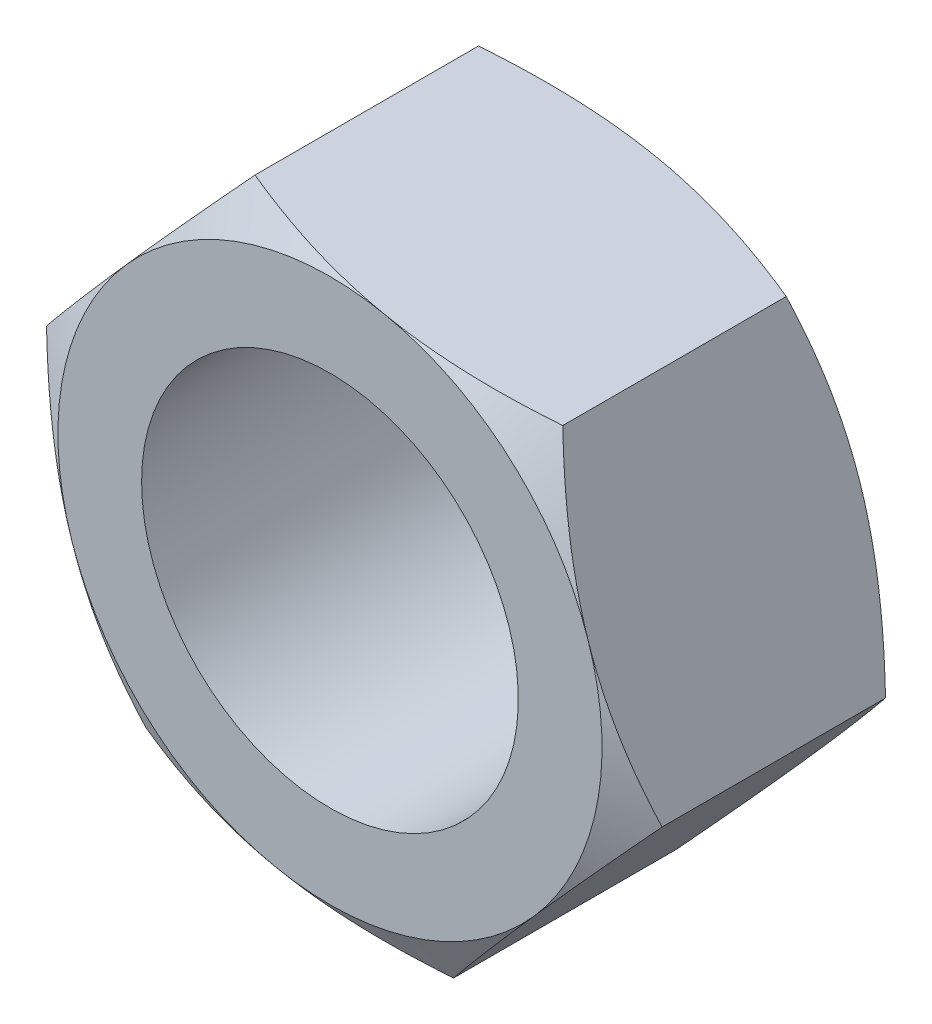
ISO-10303-21;
HEADER;
FILE_DESCRIPTION(('STEP AP214'),'2;1');
FILE_NAME('part.step','',(''),(''),'','','');
FILE_SCHEMA(('AUTOMOTIVE_DESIGN { 1 0 10303 214 1 1 1 1 }'));
ENDSEC;
DATA;
#1=APPLICATION_CONTEXT('core data for automotive mechanical design processes');
#2=APPLICATION_PROTOCOL_DEFINITION('international standard','automotive_design',2000,#1);
#3=PRODUCT_CONTEXT('',#1,'mechanical');
#4=PRODUCT('Part','Part','',(#3));
#5=PRODUCT_RELATED_PRODUCT_CATEGORY('part','',(#4));
#6=PRODUCT_DEFINITION_FORMATION('','',#4);
#7=PRODUCT_DEFINITION_CONTEXT('part definition',#1,'design');
#8=PRODUCT_DEFINITION('design','',#6,#7);
#9=PRODUCT_DEFINITION_SHAPE('','',#8);
#10=(LENGTH_UNIT() NAMED_UNIT(*) SI_UNIT(.MILLI.,.METRE.));
#11=(NAMED_UNIT(*) PLANE_ANGLE_UNIT() SI_UNIT($,.RADIAN.));
#12=(NAMED_UNIT(*) SI_UNIT($,.STERADIAN.) SOLID_ANGLE_UNIT());
#13=UNCERTAINTY_MEASURE_WITH_UNIT(LENGTH_MEASURE(1.E-05),#10,'distance_accuracy_value','');
#14=(GEOMETRIC_REPRESENTATION_CONTEXT(3) GLOBAL_UNCERTAINTY_ASSIGNED_CONTEXT((#13)) GLOBAL_UNIT_ASSIGNED_CONTEXT((#10,
#11,#12)) REPRESENTATION_CONTEXT('',''));
#15=CARTESIAN_POINT('',(0.,0.,0.));
#16=DIRECTION('',(0.,0.,1.));
#17=DIRECTION('',(1.,0.,0.));
#18=AXIS2_PLACEMENT_3D('',#15,#16,#17);
#19=CARTESIAN_POINT('',(7.35278036071434,-1.50663675131956,6.5));
#20=DIRECTION('',(-0.948765864768424,-0.315979957988199,0.));
#21=DIRECTION('',(0.315979957988199,-0.948765864768424,0.));
#22=AXIS2_PLACEMENT_3D('',#19,#20,#21);
#23=PLANE('',#22);
#24=CARTESIAN_POINT('',(4.98110927264817,5.61457620516614,0.58061743764832));
#25=CARTESIAN_POINT('',(5.03323980705143,5.45804832957287,0.532998849462768));
#26=CARTESIAN_POINT('',(5.0855647092904,5.3009368423831,0.487541373351459));
#27=CARTESIAN_POINT('',(5.19063944792609,4.98543795472667,0.401543858189983));
#28=CARTESIAN_POINT('',(5.24338945724791,4.82705003503265,0.361005940455174));
#29=CARTESIAN_POINT('',(5.40248407594242,4.34935029595192,0.247567223480101));
#30=CARTESIAN_POINT('',(5.50945668498284,4.02815283593276,0.183044575168809));
#31=CARTESIAN_POINT('',(5.66953924757371,3.5474866826176,0.107384164692823));
#32=CARTESIAN_POINT('',(5.72217089361735,3.3894541621669,0.0858307035479888));
#33=CARTESIAN_POINT('',(5.8276719991428,3.07267505929223,0.0496886910593232));
#34=CARTESIAN_POINT('',(5.88054143719578,2.91392854121077,0.0350995243315983));
#35=CARTESIAN_POINT('',(5.98637213508649,2.59615979966586,0.0132579098639535));
#36=CARTESIAN_POINT('',(6.03933322207951,2.43713809518836,0.00599713585058941));
#37=CARTESIAN_POINT('',(6.14530139351092,2.11895657365717,-0.00103979274430029));
#38=CARTESIAN_POINT('',(6.19830847647771,1.95979676102211,-0.000816178548889561));
#39=CARTESIAN_POINT('',(6.34353018903477,1.52375200497305,0.0100841644161994));
#40=CARTESIAN_POINT('',(6.43569727986356,1.24700980211273,0.028382620666913));
#41=CARTESIAN_POINT('',(6.61941929618381,0.695363492641448,0.0864068822576278));
#42=CARTESIAN_POINT('',(6.71097357556793,0.420461326041467,0.126152519402921));
#43=CARTESIAN_POINT('',(6.89506532335879,-0.132295144342159,0.225504960600811));
#44=CARTESIAN_POINT('',(6.98757956319666,-0.410079701698321,0.28553270505582));
#45=CARTESIAN_POINT('',(7.17122840479362,-0.961506295716576,0.421771420352124));
#46=CARTESIAN_POINT('',(7.26236535843509,-1.23515539417375,0.497950389879537));
#47=CARTESIAN_POINT('',(7.35284696934134,-1.50683675131956,0.580617437648319));
#48=B_SPLINE_CURVE_WITH_KNOTS('',3,(#24,#25,#26,#27,#28,#29,#30,#31,#32,#33,#34,#35,#36,#37,#38,
#39,#40,#41,#42,#43,#44,#45,#46,#47),.UNSPECIFIED.,.F.,.F.,(4,2,2,2,2,2,2,2,2,2,2,4),(0.,
0.515104363383403,1.03043005664519,2.06322275304833,2.56697047658916,3.07067367937515,
3.57380394510581,4.07691866711923,4.95277935906929,5.8294513342687,6.72556657059442,
7.61992260546549),.UNSPECIFIED.);
#49=CARTESIAN_POINT('',(4.98117588127517,5.61437620516615,0.580556583600761));
#50=VERTEX_POINT('',#49);
#51=CARTESIAN_POINT('',(6.16697812099476,2.05386972692329,0.));
#52=VERTEX_POINT('',#51);
#53=EDGE_CURVE('E131',#50,#52,#48,.T.);
#54=ORIENTED_EDGE('',*,*,#53,.F.);
#55=DIRECTION('',(0.,0.,-1.));
#56=VECTOR('',#55,1.);
#57=CARTESIAN_POINT('',(4.98117588127517,5.61437620516615,6.5));
#58=LINE('',#57,#56);
#59=CARTESIAN_POINT('',(4.98117588127517,5.61437620516615,5.91944341639924));
#60=VERTEX_POINT('',#59);
#61=EDGE_CURVE('E365',#60,#50,#58,.T.);
#62=ORIENTED_EDGE('',*,*,#61,.F.);
#63=CARTESIAN_POINT('',(7.35284696934134,-1.50683675131956,5.91938256235168));
#64=CARTESIAN_POINT('',(7.30071643493809,-1.35030887572629,5.96700115053723));
#65=CARTESIAN_POINT('',(7.24839153269911,-1.19319738853652,6.01245862664854));
#66=CARTESIAN_POINT('',(7.14331679406342,-0.877698500880091,6.09845614181002));
#67=CARTESIAN_POINT('',(7.09056678474161,-0.719310581186067,6.13899405954483));
#68=CARTESIAN_POINT('',(6.9314721660471,-0.241610842105339,6.2524327765199));
#69=CARTESIAN_POINT('',(6.82449955700667,0.079586617913818,6.31695542483119));
#70=CARTESIAN_POINT('',(6.6644169944158,0.560252771228978,6.39261583530718));
#71=CARTESIAN_POINT('',(6.61178534837216,0.718285291679686,6.41416929645201));
#72=CARTESIAN_POINT('',(6.50628424284671,1.03506439455435,6.45031130894067));
#73=CARTESIAN_POINT('',(6.45341480479374,1.19381091263581,6.4649004756684));
#74=CARTESIAN_POINT('',(6.34758410690303,1.51157965418072,6.48674209013605));
#75=CARTESIAN_POINT('',(6.29462301991,1.67060135865822,6.49400286414941));
#76=CARTESIAN_POINT('',(6.1886548484786,1.98878288018941,6.5010397927443));
#77=CARTESIAN_POINT('',(6.13564776551181,2.14794269282447,6.50081617854889));
#78=CARTESIAN_POINT('',(5.99042605295474,2.58398744887353,6.4899158355838));
#79=CARTESIAN_POINT('',(5.89825896212596,2.86072965173385,6.47161737933309));
#80=CARTESIAN_POINT('',(5.71453694580571,3.41237596120513,6.41359311774237));
#81=CARTESIAN_POINT('',(5.62298266642158,3.68727812780511,6.37384748059708));
#82=CARTESIAN_POINT('',(5.43889091863073,4.24003459818874,6.27449503939919));
#83=CARTESIAN_POINT('',(5.34637667879286,4.5178191555449,6.21446729494418));
#84=CARTESIAN_POINT('',(5.16272783719589,5.06924574956316,6.07822857964788));
#85=CARTESIAN_POINT('',(5.07159088355442,5.34289484802033,6.00204961012046));
#86=CARTESIAN_POINT('',(4.98110927264817,5.61457620516614,5.91938256235168));
#87=B_SPLINE_CURVE_WITH_KNOTS('',3,(#63,#64,#65,#66,#67,#68,#69,#70,#71,#72,#73,#74,#75,#76,#77,
#78,#79,#80,#81,#82,#83,#84,#85,#86),.UNSPECIFIED.,.F.,.F.,(4,2,2,2,2,2,2,2,2,2,2,4),(0.,
0.515104363383403,1.03043005664519,2.06322275304833,2.56697047658916,3.07067367937515,
3.57380394510581,4.07691866711923,4.95277935906929,5.8294513342687,6.72556657059442,
7.61992260546549),.UNSPECIFIED.);
#88=CARTESIAN_POINT('',(6.16697812099476,2.05386972692329,6.5));
#89=VERTEX_POINT('',#88);
#90=EDGE_CURVE('E325',#89,#60,#87,.T.);
#91=ORIENTED_EDGE('',*,*,#90,.F.);
#92=CARTESIAN_POINT('',(7.35278036071434,-1.50663675131956,5.91944341639924));
#93=VERTEX_POINT('',#92);
#94=EDGE_CURVE('E387',#93,#89,#87,.T.);
#95=ORIENTED_EDGE('',*,*,#94,.F.);
#96=DIRECTION('',(0.,0.,-1.));
#97=VECTOR('',#96,1.);
#98=CARTESIAN_POINT('',(7.35278036071434,-1.50663675131956,6.5));
#99=LINE('',#98,#97);
#100=CARTESIAN_POINT('',(7.35278036071434,-1.50663675131956,0.580556583600761));
#101=VERTEX_POINT('',#100);
#102=EDGE_CURVE('E163',#93,#101,#99,.T.);
#103=ORIENTED_EDGE('',*,*,#102,.T.);
#104=EDGE_CURVE('E144',#52,#101,#48,.T.);
#105=ORIENTED_EDGE('',*,*,#104,.F.);
#106=EDGE_LOOP('',(#54,#62,#91,#95,#103,#105));
#107=FACE_BOUND('',#106,.T.);
#108=ADVANCED_FACE('F41',(#107),#23,.F.);
#109=CARTESIAN_POINT('',(4.98117588127517,5.61437620516615,6.5));
#110=DIRECTION('',(-0.200736261679693,-0.979645320127066,0.));
#111=DIRECTION('',(0.979645320127066,-0.200736261679693,0.));
#112=AXIS2_PLACEMENT_3D('',#109,#110,#111);
#113=PLANE('',#112);
#114=CARTESIAN_POINT('',(-2.37180447943917,7.12105393790165,0.580615519425327));
#115=CARTESIAN_POINT('',(-2.21018215038261,7.08793637844189,0.532997010601241));
#116=CARTESIAN_POINT('',(-2.04795721520862,7.05469534072241,0.487539615770446));
#117=CARTESIAN_POINT('',(-1.72218990561072,6.98794331265408,0.401542266698612));
#118=CARTESIAN_POINT('',(-1.55864699506072,6.9544322124492,0.361004433774083));
#119=CARTESIAN_POINT('',(-1.06539975137597,6.85336236018037,0.247565977151666));
#120=CARTESIAN_POINT('',(-0.733748408298452,6.78540465199493,0.183043508874198));
#121=CARTESIAN_POINT('',(-0.23743821045195,6.68370717873359,0.107383366660864));
#122=CARTESIAN_POINT('',(-0.0742622667247136,6.6502712726287,0.0858299932577934));
#123=CARTESIAN_POINT('',(0.252826919878906,6.58324838260342,0.0496881554182035));
#124=CARTESIAN_POINT('',(0.416740096319004,6.54966141229628,0.0350990755985153));
#125=CARTESIAN_POINT('',(0.744851125014552,6.48242913959204,0.0132576318612121));
#126=CARTESIAN_POINT('',(0.909048441398896,6.44878394699871,0.00599694170510086));
#127=CARTESIAN_POINT('',(1.2375856782752,6.3814643412208,-0.0010398241897417));
#128=CARTESIAN_POINT('',(1.40192559420477,6.34778992897109,-0.000816131154068615));
#129=CARTESIAN_POINT('',(1.85216125476487,6.2555334545932,0.0100843973127286));
#130=CARTESIAN_POINT('',(2.13790961081703,6.19698159342819,0.0283828855305852));
#131=CARTESIAN_POINT('',(2.70750841018793,6.08026676685389,0.0864070606806037));
#132=CARTESIAN_POINT('',(2.99135685038559,6.02210421189829,0.126152579074529));
#133=CARTESIAN_POINT('',(3.56210192361002,5.90515450569614,0.225504649614825));
#134=CARTESIAN_POINT('',(3.84892654102414,5.84638211095847,0.285532137396243));
#135=CARTESIAN_POINT('',(4.41829846210997,5.72971377335101,0.421770241815769));
#136=CARTESIAN_POINT('',(4.70085305729889,5.67181633639772,0.49794885762443));
#137=CARTESIAN_POINT('',(4.98137588127517,5.61433522375021,0.580615519425326));
#138=B_SPLINE_CURVE_WITH_KNOTS('',3,(#114,#115,#116,#117,#118,#119,#120,#121,#122,#123,#124,
#125,#126,#127,#128,#129,#130,#131,#132,#133,#134,#135,#136,#137),.UNSPECIFIED.,.F.,.F.,(4,2,2,
2,2,2,2,2,2,2,2,4),(0.,0.515104136062556,1.03042960186965,2.06322183084992,2.56696934861908,
3.07067234569869,3.57380240813289,4.07691692667551,4.95277467811996,5.82944370172938,
6.7255558302944,7.61990877944166),.UNSPECIFIED.);
#139=CARTESIAN_POINT('',(-2.37160447943917,7.12101295648571,0.580556583600761));
#140=VERTEX_POINT('',#139);
#141=CARTESIAN_POINT('',(1.304785700918,6.36769458082593,0.));
#142=VERTEX_POINT('',#141);
#143=EDGE_CURVE('E58',#140,#142,#138,.T.);
#144=ORIENTED_EDGE('',*,*,#143,.F.);
#145=DIRECTION('',(0.,0.,-1.));
#146=VECTOR('',#145,1.);
#147=CARTESIAN_POINT('',(-2.37160447943917,7.12101295648571,6.5));
#148=LINE('',#147,#146);
#149=CARTESIAN_POINT('',(-2.37160447943917,7.12101295648571,5.91944341639924));
#150=VERTEX_POINT('',#149);
#151=EDGE_CURVE('E318',#150,#140,#148,.T.);
#152=ORIENTED_EDGE('',*,*,#151,.F.);
#153=CARTESIAN_POINT('',(4.98137588127517,5.61433522375021,5.91938448057467));
#154=CARTESIAN_POINT('',(4.81975355221861,5.64745278320996,5.96700298939876));
#155=CARTESIAN_POINT('',(4.65752861704462,5.68069382092945,6.01246038422955));
#156=CARTESIAN_POINT('',(4.33176130744672,5.74744584899778,6.09845773330139));
#157=CARTESIAN_POINT('',(4.16821839689672,5.78095694920266,6.13899556622592));
#158=CARTESIAN_POINT('',(3.67497115321198,5.88202680147148,6.25243402284833));
#159=CARTESIAN_POINT('',(3.34331981013445,5.94998450965693,6.3169564911258));
#160=CARTESIAN_POINT('',(2.84700961228795,6.05168198291827,6.39261663333914));
#161=CARTESIAN_POINT('',(2.68383366856072,6.08511788902315,6.41417000674221));
#162=CARTESIAN_POINT('',(2.3567444819571,6.15214077904844,6.4503118445818));
#163=CARTESIAN_POINT('',(2.192831305517,6.18572774935557,6.46490092440148));
#164=CARTESIAN_POINT('',(1.86472027682145,6.25296002205982,6.48674236813879));
#165=CARTESIAN_POINT('',(1.70052296043711,6.28660521465315,6.4940030582949));
#166=CARTESIAN_POINT('',(1.3719857235608,6.35392482043106,6.50103982418974));
#167=CARTESIAN_POINT('',(1.20764580763123,6.38759923268077,6.50081613115407));
#168=CARTESIAN_POINT('',(0.757410147071129,6.47985570705865,6.48991560268727));
#169=CARTESIAN_POINT('',(0.471661791018968,6.53840756822366,6.47161711446941));
#170=CARTESIAN_POINT('',(-0.0979370083519269,6.65512239479796,6.4135929393194));
#171=CARTESIAN_POINT('',(-0.381785448549587,6.71328494975356,6.37384742092547));
#172=CARTESIAN_POINT('',(-0.952530521774022,6.83023465595572,6.27449535038518));
#173=CARTESIAN_POINT('',(-1.23935513918814,6.88900705069339,6.21446786260376));
#174=CARTESIAN_POINT('',(-1.80872706027396,7.00567538830085,6.07822975818423));
#175=CARTESIAN_POINT('',(-2.09128165546288,7.06357282525414,6.00205114237557));
#176=CARTESIAN_POINT('',(-2.37180447943917,7.12105393790165,5.91938448057467));
#177=B_SPLINE_CURVE_WITH_KNOTS('',3,(#153,#154,#155,#156,#157,#158,#159,#160,#161,#162,#163,
#164,#165,#166,#167,#168,#169,#170,#171,#172,#173,#174,#175,#176),.UNSPECIFIED.,.F.,.F.,(4,2,2,
2,2,2,2,2,2,2,2,4),(0.,0.515104136062556,1.03042960186965,2.06322183084992,2.56696934861908,
3.07067234569869,3.57380240813289,4.07691692667551,4.95277467811996,5.82944370172938,
6.7255558302944,7.61990877944166),.UNSPECIFIED.);
#178=CARTESIAN_POINT('',(1.304785700918,6.36769458082593,6.5));
#179=VERTEX_POINT('',#178);
#180=EDGE_CURVE('E276',#179,#150,#177,.T.);
#181=ORIENTED_EDGE('',*,*,#180,.F.);
#182=EDGE_CURVE('E316',#60,#179,#177,.T.);
#183=ORIENTED_EDGE('',*,*,#182,.F.);
#184=ORIENTED_EDGE('',*,*,#61,.T.);
#185=EDGE_CURVE('E137',#142,#50,#138,.T.);
#186=ORIENTED_EDGE('',*,*,#185,.F.);
#187=EDGE_LOOP('',(#144,#152,#181,#183,#184,#186));
#188=FACE_BOUND('',#187,.T.);
#189=ADVANCED_FACE('F269',(#188),#113,.F.);
#190=CARTESIAN_POINT('',(-2.37160447943917,7.12101295648571,6.5));
#191=DIRECTION('',(0.748029603088732,-0.663665362138867,0.));
#192=DIRECTION('',(0.663665362138867,0.748029603088732,0.));
#193=AXIS2_PLACEMENT_3D('',#190,#191,#192);
#194=PLANE('',#193);
#195=CARTESIAN_POINT('',(-7.35295780432336,1.50643675131956,0.580633768473079));
#196=CARTESIAN_POINT('',(-7.24346563874702,1.62984741252002,0.533014504647287));
#197=CARTESIAN_POINT('',(-7.13356523306898,1.75371820875036,0.487556336558026));
#198=CARTESIAN_POINT('',(-6.91287190890758,2.00246576903397,0.40155740739989));
#199=CARTESIAN_POINT('',(-6.80207862721946,2.12734294246211,0.361018767636554));
#200=CARTESIAN_POINT('',(-6.46792481732045,2.50397393158557,0.247577834160306));
#201=CARTESIAN_POINT('',(-6.24324526136652,2.75721444804212,0.183053653138298));
#202=CARTESIAN_POINT('',(-5.9070163879322,3.13618427996386,0.107390958817788));
#203=CARTESIAN_POINT('',(-5.79647170701127,3.26078125083237,0.0858367506865429));
#204=CARTESIAN_POINT('',(-5.57488283659358,3.51053819799807,0.0496932513285491));
#205=CARTESIAN_POINT('',(-5.46383869210678,3.6356981235637,0.0351033447117424));
#206=CARTESIAN_POINT('',(-5.24155752919408,3.88623536650768,0.0132602767356341));
#207=CARTESIAN_POINT('',(-5.13032087383697,4.01161227466443,0.00599878880535876));
#208=CARTESIAN_POINT('',(-4.90775093199848,4.26247500571967,-0.00103952493348788));
#209=CARTESIAN_POINT('',(-4.79641764860829,4.38796082513404,-0.000816581943566919));
#210=CARTESIAN_POINT('',(-4.49139671897416,4.73175560175557,0.0100821817219139));
#211=CARTESIAN_POINT('',(-4.29780890730495,4.94995203355222,0.028380365795537));
#212=CARTESIAN_POINT('',(-3.91191908537853,5.3848956464015,0.086405363265686));
#213=CARTESIAN_POINT('',(-3.71961843234751,5.60164129769918,0.126152011392295));
#214=CARTESIAN_POINT('',(-3.33295193651343,6.03746031419014,0.225507608178618));
#215=CARTESIAN_POINT('',(-3.13863488650536,6.25647868411449,0.28553753782903));
#216=CARTESIAN_POINT('',(-2.75289868855462,6.6912491445166,0.421781453838648));
#217=CARTESIAN_POINT('',(-2.5614746001791,6.90700680344833,0.497963434759542));
#218=CARTESIAN_POINT('',(-2.37142703583015,7.12121295648571,0.58063376847308));
#219=B_SPLINE_CURVE_WITH_KNOTS('',3,(#195,#196,#197,#198,#199,#200,#201,#202,#203,#204,#205,
#206,#207,#208,#209,#210,#211,#212,#213,#214,#215,#216,#217,#218),.UNSPECIFIED.,.F.,.F.,(4,2,2,
2,2,2,2,2,2,2,2,4),(0.,0.515106298682677,1.03043392838318,2.06323060419747,2.5669800795792,
3.07068503365017,3.57381703014882,4.07693348441447,4.95281921022816,5.82951631366116,
6.72565800780234,7.6200403128717),.UNSPECIFIED.);
#220=CARTESIAN_POINT('',(-7.35278036071434,1.50663675131956,0.58055658360076));
#221=VERTEX_POINT('',#220);
#222=CARTESIAN_POINT('',(-4.86219242007676,4.31382485390264,0.));
#223=VERTEX_POINT('',#222);
#224=EDGE_CURVE('E65',#221,#223,#219,.T.);
#225=ORIENTED_EDGE('',*,*,#224,.F.);
#226=DIRECTION('',(0.,0.,-1.));
#227=VECTOR('',#226,1.);
#228=CARTESIAN_POINT('',(-7.35278036071434,1.50663675131956,6.5));
#229=LINE('',#228,#227);
#230=CARTESIAN_POINT('',(-7.35278036071434,1.50663675131956,5.91944341639924));
#231=VERTEX_POINT('',#230);
#232=EDGE_CURVE('E353',#231,#221,#229,.T.);
#233=ORIENTED_EDGE('',*,*,#232,.F.);
#234=CARTESIAN_POINT('',(-2.37142703583015,7.12121295648571,5.91936623152692));
#235=CARTESIAN_POINT('',(-2.48091920140649,6.99780229528526,5.96698549535271));
#236=CARTESIAN_POINT('',(-2.59081960708454,6.87393149905491,6.01244366344197));
#237=CARTESIAN_POINT('',(-2.81151293124593,6.6251839387713,6.09844259260011));
#238=CARTESIAN_POINT('',(-2.92230621293405,6.50030676534317,6.13898123236344));
#239=CARTESIAN_POINT('',(-3.25646002283306,6.1236757762197,6.25242216583969));
#240=CARTESIAN_POINT('',(-3.48113957878699,5.87043525976315,6.3169463468617));
#241=CARTESIAN_POINT('',(-3.81736845222131,5.49146542784141,6.39260904118221));
#242=CARTESIAN_POINT('',(-3.92791313314224,5.3668684569729,6.41416324931345));
#243=CARTESIAN_POINT('',(-4.14950200355993,5.1171115098072,6.45030674867145));
#244=CARTESIAN_POINT('',(-4.26054614804673,4.99195158424158,6.46489665528826));
#245=CARTESIAN_POINT('',(-4.48282731095943,4.7414143412976,6.48673972326436));
#246=CARTESIAN_POINT('',(-4.59406396631654,4.61603743314085,6.49400121119464));
#247=CARTESIAN_POINT('',(-4.81663390815503,4.3651747020856,6.50103952493349));
#248=CARTESIAN_POINT('',(-4.92796719154522,4.23968888267123,6.50081658194357));
#249=CARTESIAN_POINT('',(-5.23298812117936,3.8958941060497,6.48991781827808));
#250=CARTESIAN_POINT('',(-5.42657593284856,3.67769767425305,6.47161963420446));
#251=CARTESIAN_POINT('',(-5.81246575477498,3.24275406140378,6.41359463673431));
#252=CARTESIAN_POINT('',(-6.004766407806,3.0260084101061,6.3738479886077));
#253=CARTESIAN_POINT('',(-6.39143290364008,2.59018939361514,6.27449239182138));
#254=CARTESIAN_POINT('',(-6.58574995364816,2.37117102369078,6.21446246217097));
#255=CARTESIAN_POINT('',(-6.97148615159889,1.93640056328867,6.07821854616135));
#256=CARTESIAN_POINT('',(-7.16291023997441,1.72064290435694,6.00203656524046));
#257=CARTESIAN_POINT('',(-7.35295780432336,1.50643675131956,5.91936623152692));
#258=B_SPLINE_CURVE_WITH_KNOTS('',3,(#234,#235,#236,#237,#238,#239,#240,#241,#242,#243,#244,
#245,#246,#247,#248,#249,#250,#251,#252,#253,#254,#255,#256,#257),.UNSPECIFIED.,.F.,.F.,(4,2,2,
2,2,2,2,2,2,2,2,4),(0.,0.515106298682677,1.03043392838318,2.06323060419747,2.5669800795792,
3.07068503365018,3.57381703014882,4.07693348441447,4.95281921022817,5.82951631366116,
6.72565800780234,7.6200403128717),.UNSPECIFIED.);
#259=CARTESIAN_POINT('',(-4.86219242007676,4.31382485390264,6.5));
#260=VERTEX_POINT('',#259);
#261=EDGE_CURVE('E255',#260,#231,#258,.T.);
#262=ORIENTED_EDGE('',*,*,#261,.F.);
#263=EDGE_CURVE('E322',#150,#260,#258,.T.);
#264=ORIENTED_EDGE('',*,*,#263,.F.);
#265=ORIENTED_EDGE('',*,*,#151,.T.);
#266=EDGE_CURVE('E202',#223,#140,#219,.T.);
#267=ORIENTED_EDGE('',*,*,#266,.F.);
#268=EDGE_LOOP('',(#225,#233,#262,#264,#265,#267));
#269=FACE_BOUND('',#268,.T.);
#270=ADVANCED_FACE('F264',(#269),#194,.F.);
#271=CARTESIAN_POINT('',(-7.35278036071434,1.50663675131956,6.5));
#272=DIRECTION('',(0.948765864768424,0.315979957988199,0.));
#273=DIRECTION('',(-0.315979957988199,0.948765864768424,0.));
#274=AXIS2_PLACEMENT_3D('',#271,#272,#273);
#275=PLANE('',#274);
#276=CARTESIAN_POINT('',(-4.98110927264817,-5.61457620516615,0.580617437648319));
#277=CARTESIAN_POINT('',(-5.03323980705142,-5.45804832957287,0.532998849462768));
#278=CARTESIAN_POINT('',(-5.0855647092904,-5.30093684238311,0.487541373351457));
#279=CARTESIAN_POINT('',(-5.19063944792609,-4.98543795472667,0.401543858189982));
#280=CARTESIAN_POINT('',(-5.2433894572479,-4.82705003503265,0.361005940455172));
#281=CARTESIAN_POINT('',(-5.40248407594241,-4.34935029595192,0.2475672234801));
#282=CARTESIAN_POINT('',(-5.50945668498284,-4.02815283593277,0.183044575168808));
#283=CARTESIAN_POINT('',(-5.66953924757371,-3.54748668261761,0.107384164692822));
#284=CARTESIAN_POINT('',(-5.72217089361735,-3.3894541621669,0.0858307035479884));
#285=CARTESIAN_POINT('',(-5.8276719991428,-3.07267505929223,0.0496886910593226));
#286=CARTESIAN_POINT('',(-5.88054143719577,-2.91392854121078,0.0350995243315972));
#287=CARTESIAN_POINT('',(-5.98637213508648,-2.59615979966587,0.0132579098639523));
#288=CARTESIAN_POINT('',(-6.03933322207951,-2.43713809518836,0.00599713585058838));
#289=CARTESIAN_POINT('',(-6.14530139351091,-2.11895657365717,-0.00103979274430128));
#290=CARTESIAN_POINT('',(-6.1983084764777,-1.95979676102211,-0.000816178548890712));
#291=CARTESIAN_POINT('',(-6.34353018903477,-1.52375200497305,0.010084164416198));
#292=CARTESIAN_POINT('',(-6.43569727986355,-1.24700980211274,0.0283826206669115));
#293=CARTESIAN_POINT('',(-6.61941929618381,-0.695363492641451,0.0864068822576266));
#294=CARTESIAN_POINT('',(-6.71097357556793,-0.42046132604147,0.12615251940292));
#295=CARTESIAN_POINT('',(-6.89506532335879,0.132295144342158,0.225504960600811));
#296=CARTESIAN_POINT('',(-6.98757956319666,0.41007970169832,0.285532705055819));
#297=CARTESIAN_POINT('',(-7.17122840479362,0.961506295716577,0.421771420352123));
#298=CARTESIAN_POINT('',(-7.26236535843509,1.23515539417375,0.497950389879536));
#299=CARTESIAN_POINT('',(-7.35284696934134,1.50683675131956,0.580617437648319));
#300=B_SPLINE_CURVE_WITH_KNOTS('',3,(#276,#277,#278,#279,#280,#281,#282,#283,#284,#285,#286,
#287,#288,#289,#290,#291,#292,#293,#294,#295,#296,#297,#298,#299),.UNSPECIFIED.,.F.,.F.,(4,2,2,
2,2,2,2,2,2,2,2,4),(0.,0.515104363383404,1.03043005664519,2.06322275304833,2.56697047658916,
3.07067367937514,3.57380394510581,4.07691866711923,4.95277935906929,5.8294513342687,
6.72556657059442,7.61992260546549),.UNSPECIFIED.);
#301=CARTESIAN_POINT('',(-4.98117588127517,-5.61437620516615,0.580556583600761));
#302=VERTEX_POINT('',#301);
#303=CARTESIAN_POINT('',(-6.16697812099476,-2.05386972692329,0.));
#304=VERTEX_POINT('',#303);
#305=EDGE_CURVE('E180',#302,#304,#300,.T.);
#306=ORIENTED_EDGE('',*,*,#305,.F.);
#307=DIRECTION('',(0.,0.,-1.));
#308=VECTOR('',#307,1.);
#309=CARTESIAN_POINT('',(-4.98117588127517,-5.61437620516615,6.5));
#310=LINE('',#309,#308);
#311=CARTESIAN_POINT('',(-4.98117588127517,-5.61437620516615,5.91944341639924));
#312=VERTEX_POINT('',#311);
#313=EDGE_CURVE('E349',#312,#302,#310,.T.);
#314=ORIENTED_EDGE('',*,*,#313,.F.);
#315=CARTESIAN_POINT('',(-7.35284696934134,1.50683675131956,5.91938256235168));
#316=CARTESIAN_POINT('',(-7.30071643493809,1.35030887572629,5.96700115053723));
#317=CARTESIAN_POINT('',(-7.24839153269911,1.19319738853652,6.01245862664854));
#318=CARTESIAN_POINT('',(-7.14331679406342,0.877698500880091,6.09845614181002));
#319=CARTESIAN_POINT('',(-7.09056678474161,0.719310581186068,6.13899405954483));
#320=CARTESIAN_POINT('',(-6.93147216604709,0.24161084210534,6.2524327765199));
#321=CARTESIAN_POINT('',(-6.82449955700667,-0.0795866179138175,6.31695542483119));
#322=CARTESIAN_POINT('',(-6.6644169944158,-0.560252771228977,6.39261583530718));
#323=CARTESIAN_POINT('',(-6.61178534837216,-0.718285291679685,6.41416929645201));
#324=CARTESIAN_POINT('',(-6.50628424284671,-1.03506439455435,6.45031130894068));
#325=CARTESIAN_POINT('',(-6.45341480479373,-1.19381091263581,6.4649004756684));
#326=CARTESIAN_POINT('',(-6.34758410690303,-1.51157965418072,6.48674209013605));
#327=CARTESIAN_POINT('',(-6.29462301991,-1.67060135865822,6.49400286414941));
#328=CARTESIAN_POINT('',(-6.18865484847859,-1.98878288018941,6.5010397927443));
#329=CARTESIAN_POINT('',(-6.13564776551181,-2.14794269282447,6.50081617854889));
#330=CARTESIAN_POINT('',(-5.99042605295474,-2.58398744887353,6.4899158355838));
#331=CARTESIAN_POINT('',(-5.89825896212595,-2.86072965173385,6.47161737933309));
#332=CARTESIAN_POINT('',(-5.7145369458057,-3.41237596120513,6.41359311774237));
#333=CARTESIAN_POINT('',(-5.62298266642158,-3.68727812780511,6.37384748059708));
#334=CARTESIAN_POINT('',(-5.43889091863072,-4.24003459818874,6.27449503939919));
#335=CARTESIAN_POINT('',(-5.34637667879285,-4.51781915554491,6.21446729494418));
#336=CARTESIAN_POINT('',(-5.16272783719589,-5.06924574956316,6.07822857964788));
#337=CARTESIAN_POINT('',(-5.07159088355442,-5.34289484802034,6.00204961012046));
#338=CARTESIAN_POINT('',(-4.98110927264817,-5.61457620516615,5.91938256235168));
#339=B_SPLINE_CURVE_WITH_KNOTS('',3,(#315,#316,#317,#318,#319,#320,#321,#322,#323,#324,#325,
#326,#327,#328,#329,#330,#331,#332,#333,#334,#335,#336,#337,#338),.UNSPECIFIED.,.F.,.F.,(4,2,2,
2,2,2,2,2,2,2,2,4),(0.,0.515104363383403,1.03043005664519,2.06322275304833,2.56697047658916,
3.07067367937515,3.57380394510581,4.07691866711923,4.95277935906929,5.8294513342687,
6.72556657059442,7.61992260546549),.UNSPECIFIED.);
#340=CARTESIAN_POINT('',(-6.16697812099476,-2.05386972692329,6.5));
#341=VERTEX_POINT('',#340);
#342=EDGE_CURVE('E247',#341,#312,#339,.T.);
#343=ORIENTED_EDGE('',*,*,#342,.F.);
#344=EDGE_CURVE('E254',#231,#341,#339,.T.);
#345=ORIENTED_EDGE('',*,*,#344,.F.);
#346=ORIENTED_EDGE('',*,*,#232,.T.);
#347=EDGE_CURVE('E289',#304,#221,#300,.T.);
#348=ORIENTED_EDGE('',*,*,#347,.F.);
#349=EDGE_LOOP('',(#306,#314,#343,#345,#346,#348));
#350=FACE_BOUND('',#349,.T.);
#351=ADVANCED_FACE('F261',(#350),#275,.F.);
#352=CARTESIAN_POINT('',(-4.98117588127517,-5.61437620516615,6.5));
#353=DIRECTION('',(0.200736261679692,0.979645320127066,0.));
#354=DIRECTION('',(-0.979645320127066,0.200736261679692,0.));
#355=AXIS2_PLACEMENT_3D('',#352,#353,#354);
#356=PLANE('',#355);
#357=CARTESIAN_POINT('',(2.37180447943917,-7.12105393790165,0.580615519425326));
#358=CARTESIAN_POINT('',(2.21018215038261,-7.08793637844189,0.53299701060124));
#359=CARTESIAN_POINT('',(2.04795721520862,-7.05469534072241,0.487539615770445));
#360=CARTESIAN_POINT('',(1.72218990561071,-6.98794331265408,0.401542266698612));
#361=CARTESIAN_POINT('',(1.55864699506072,-6.9544322124492,0.361004433774083));
#362=CARTESIAN_POINT('',(1.06539975137597,-6.85336236018037,0.247565977151666));
#363=CARTESIAN_POINT('',(0.73374840829845,-6.78540465199493,0.183043508874198));
#364=CARTESIAN_POINT('',(0.237438210451949,-6.68370717873359,0.107383366660864));
#365=CARTESIAN_POINT('',(0.0742622667247125,-6.6502712726287,0.0858299932577937));
#366=CARTESIAN_POINT('',(-0.252826919878907,-6.58324838260342,0.0496881554182037));
#367=CARTESIAN_POINT('',(-0.416740096319005,-6.54966141229629,0.0350990755985155));
#368=CARTESIAN_POINT('',(-0.744851125014553,-6.48242913959204,0.0132576318612124));
#369=CARTESIAN_POINT('',(-0.909048441398898,-6.44878394699871,0.00599694170510123));
#370=CARTESIAN_POINT('',(-1.2375856782752,-6.3814643412208,-0.00103982418974132));
#371=CARTESIAN_POINT('',(-1.40192559420477,-6.34778992897109,-0.000816131154068285));
#372=CARTESIAN_POINT('',(-1.85216125476487,-6.2555334545932,0.0100843973127291));
#373=CARTESIAN_POINT('',(-2.13790961081703,-6.1969815934282,0.0283828855305859));
#374=CARTESIAN_POINT('',(-2.70750841018793,-6.0802667668539,0.0864070606806043));
#375=CARTESIAN_POINT('',(-2.99135685038559,-6.02210421189829,0.126152579074529));
#376=CARTESIAN_POINT('',(-3.56210192361002,-5.90515450569614,0.225504649614825));
#377=CARTESIAN_POINT('',(-3.84892654102414,-5.84638211095847,0.285532137396243));
#378=CARTESIAN_POINT('',(-4.41829846210996,-5.72971377335101,0.421770241815768));
#379=CARTESIAN_POINT('',(-4.70085305729888,-5.67181633639772,0.49794885762443));
#380=CARTESIAN_POINT('',(-4.98137588127517,-5.61433522375021,0.580615519425326));
#381=B_SPLINE_CURVE_WITH_KNOTS('',3,(#357,#358,#359,#360,#361,#362,#363,#364,#365,#366,#367,
#368,#369,#370,#371,#372,#373,#374,#375,#376,#377,#378,#379,#380),.UNSPECIFIED.,.F.,.F.,(4,2,2,
2,2,2,2,2,2,2,2,4),(0.,0.515104136062556,1.03042960186965,2.06322183084992,2.56696934861908,
3.07067234569869,3.57380240813289,4.07691692667551,4.95277467811996,5.82944370172937,
6.72555583029439,7.61990877944166),.UNSPECIFIED.);
#382=CARTESIAN_POINT('',(2.37160447943917,-7.12101295648571,0.580556583600761));
#383=VERTEX_POINT('',#382);
#384=CARTESIAN_POINT('',(-1.304785700918,-6.36769458082593,0.));
#385=VERTEX_POINT('',#384);
#386=EDGE_CURVE('E165',#383,#385,#381,.T.);
#387=ORIENTED_EDGE('',*,*,#386,.F.);
#388=DIRECTION('',(0.,0.,-1.));
#389=VECTOR('',#388,1.);
#390=CARTESIAN_POINT('',(2.37160447943917,-7.12101295648571,6.5));
#391=LINE('',#390,#389);
#392=CARTESIAN_POINT('',(2.37160447943917,-7.12101295648571,5.91944341639924));
#393=VERTEX_POINT('',#392);
#394=EDGE_CURVE('E354',#393,#383,#391,.T.);
#395=ORIENTED_EDGE('',*,*,#394,.F.);
#396=CARTESIAN_POINT('',(-4.98137588127517,-5.61433522375021,5.91938448057467));
#397=CARTESIAN_POINT('',(-4.8197535522186,-5.64745278320997,5.96700298939876));
#398=CARTESIAN_POINT('',(-4.65752861704462,-5.68069382092945,6.01246038422955));
#399=CARTESIAN_POINT('',(-4.33176130744671,-5.74744584899778,6.09845773330139));
#400=CARTESIAN_POINT('',(-4.16821839689672,-5.78095694920266,6.13899556622592));
#401=CARTESIAN_POINT('',(-3.67497115321197,-5.88202680147149,6.25243402284833));
#402=CARTESIAN_POINT('',(-3.34331981013445,-5.94998450965693,6.3169564911258));
#403=CARTESIAN_POINT('',(-2.84700961228795,-6.05168198291827,6.39261663333914));
#404=CARTESIAN_POINT('',(-2.68383366856071,-6.08511788902316,6.41417000674221));
#405=CARTESIAN_POINT('',(-2.35674448195709,-6.15214077904844,6.4503118445818));
#406=CARTESIAN_POINT('',(-2.19283130551699,-6.18572774935557,6.46490092440148));
#407=CARTESIAN_POINT('',(-1.86472027682145,-6.25296002205982,6.48674236813879));
#408=CARTESIAN_POINT('',(-1.7005229604371,-6.28660521465315,6.4940030582949));
#409=CARTESIAN_POINT('',(-1.3719857235608,-6.35392482043106,6.50103982418974));
#410=CARTESIAN_POINT('',(-1.20764580763123,-6.38759923268077,6.50081613115407));
#411=CARTESIAN_POINT('',(-0.757410147071126,-6.47985570705866,6.48991560268727));
#412=CARTESIAN_POINT('',(-0.471661791018965,-6.53840756822366,6.47161711446941));
#413=CARTESIAN_POINT('',(0.0979370083519288,-6.65512239479796,6.4135929393194));
#414=CARTESIAN_POINT('',(0.381785448549589,-6.71328494975357,6.37384742092547));
#415=CARTESIAN_POINT('',(0.952530521774023,-6.83023465595572,6.27449535038517));
#416=CARTESIAN_POINT('',(1.23935513918814,-6.88900705069339,6.21446786260376));
#417=CARTESIAN_POINT('',(1.80872706027396,-7.00567538830085,6.07822975818423));
#418=CARTESIAN_POINT('',(2.09128165546288,-7.06357282525414,6.00205114237557));
#419=CARTESIAN_POINT('',(2.37180447943917,-7.12105393790165,5.91938448057467));
#420=B_SPLINE_CURVE_WITH_KNOTS('',3,(#396,#397,#398,#399,#400,#401,#402,#403,#404,#405,#406,
#407,#408,#409,#410,#411,#412,#413,#414,#415,#416,#417,#418,#419),.UNSPECIFIED.,.F.,.F.,(4,2,2,
2,2,2,2,2,2,2,2,4),(0.,0.515104136062556,1.03042960186965,2.06322183084992,2.56696934861908,
3.07067234569869,3.57380240813289,4.07691692667551,4.95277467811995,5.82944370172937,
6.72555583029439,7.61990877944166),.UNSPECIFIED.);
#421=CARTESIAN_POINT('',(-1.304785700918,-6.36769458082593,6.5));
#422=VERTEX_POINT('',#421);
#423=EDGE_CURVE('E239',#422,#393,#420,.T.);
#424=ORIENTED_EDGE('',*,*,#423,.F.);
#425=EDGE_CURVE('E246',#312,#422,#420,.T.);
#426=ORIENTED_EDGE('',*,*,#425,.F.);
#427=ORIENTED_EDGE('',*,*,#313,.T.);
#428=EDGE_CURVE('E143',#385,#302,#381,.T.);
#429=ORIENTED_EDGE('',*,*,#428,.F.);
#430=EDGE_LOOP('',(#387,#395,#424,#426,#427,#429));
#431=FACE_BOUND('',#430,.T.);
#432=ADVANCED_FACE('F225',(#431),#356,.F.);
#433=CARTESIAN_POINT('',(2.37160447943917,-7.12101295648571,6.5));
#434=DIRECTION('',(-0.748029603088732,0.663665362138868,0.));
#435=DIRECTION('',(-0.663665362138868,-0.748029603088732,0.));
#436=AXIS2_PLACEMENT_3D('',#433,#434,#435);
#437=PLANE('',#436);
#438=CARTESIAN_POINT('',(7.35295780432337,-1.50643675131956,0.58063376847308));
#439=CARTESIAN_POINT('',(7.24346563874702,-1.62984741252002,0.533014504647288));
#440=CARTESIAN_POINT('',(7.13356523306898,-1.75371820875036,0.487556336558026));
#441=CARTESIAN_POINT('',(6.91287190890758,-2.00246576903397,0.401557407399891));
#442=CARTESIAN_POINT('',(6.80207862721946,-2.12734294246211,0.361018767636555));
#443=CARTESIAN_POINT('',(6.46792481732045,-2.50397393158557,0.247577834160308));
#444=CARTESIAN_POINT('',(6.24324526136652,-2.75721444804212,0.183053653138299));
#445=CARTESIAN_POINT('',(5.9070163879322,-3.13618427996386,0.107390958817788));
#446=CARTESIAN_POINT('',(5.79647170701127,-3.26078125083237,0.0858367506865432));
#447=CARTESIAN_POINT('',(5.57488283659358,-3.51053819799807,0.0496932513285494));
#448=CARTESIAN_POINT('',(5.46383869210678,-3.6356981235637,0.0351033447117426));
#449=CARTESIAN_POINT('',(5.24155752919408,-3.88623536650768,0.0132602767356344));
#450=CARTESIAN_POINT('',(5.13032087383697,-4.01161227466443,0.00599878880535906));
#451=CARTESIAN_POINT('',(4.90775093199848,-4.26247500571967,-0.0010395249334877));
#452=CARTESIAN_POINT('',(4.79641764860829,-4.38796082513404,-0.000816581943566842));
#453=CARTESIAN_POINT('',(4.49139671897416,-4.73175560175557,0.0100821817219138));
#454=CARTESIAN_POINT('',(4.29780890730495,-4.94995203355222,0.0283803657955367));
#455=CARTESIAN_POINT('',(3.91191908537853,-5.3848956464015,0.086405363265686));
#456=CARTESIAN_POINT('',(3.71961843234751,-5.60164129769918,0.126152011392295));
#457=CARTESIAN_POINT('',(3.33295193651343,-6.03746031419014,0.225507608178618));
#458=CARTESIAN_POINT('',(3.13863488650535,-6.25647868411449,0.28553753782903));
#459=CARTESIAN_POINT('',(2.75289868855462,-6.6912491445166,0.421781453838648));
#460=CARTESIAN_POINT('',(2.5614746001791,-6.90700680344833,0.497963434759542));
#461=CARTESIAN_POINT('',(2.37142703583015,-7.12121295648571,0.58063376847308));
#462=B_SPLINE_CURVE_WITH_KNOTS('',3,(#438,#439,#440,#441,#442,#443,#444,#445,#446,#447,#448,
#449,#450,#451,#452,#453,#454,#455,#456,#457,#458,#459,#460,#461),.UNSPECIFIED.,.F.,.F.,(4,2,2,
2,2,2,2,2,2,2,2,4),(0.,0.515106298682676,1.03043392838318,2.06323060419747,2.5669800795792,
3.07068503365018,3.57381703014882,4.07693348441447,4.95281921022817,5.82951631366116,
6.72565800780234,7.6200403128717),.UNSPECIFIED.);
#463=CARTESIAN_POINT('',(4.86219242007676,-4.31382485390264,0.));
#464=VERTEX_POINT('',#463);
#465=EDGE_CURVE('E150',#101,#464,#462,.T.);
#466=ORIENTED_EDGE('',*,*,#465,.F.);
#467=ORIENTED_EDGE('',*,*,#102,.F.);
#468=CARTESIAN_POINT('',(2.37142703583015,-7.12121295648571,5.91936623152692));
#469=CARTESIAN_POINT('',(2.48091920140649,-6.99780229528526,5.96698549535271));
#470=CARTESIAN_POINT('',(2.59081960708453,-6.87393149905492,6.01244366344197));
#471=CARTESIAN_POINT('',(2.81151293124593,-6.62518393877131,6.09844259260011));
#472=CARTESIAN_POINT('',(2.92230621293405,-6.50030676534317,6.13898123236344));
#473=CARTESIAN_POINT('',(3.25646002283306,-6.1236757762197,6.25242216583969));
#474=CARTESIAN_POINT('',(3.48113957878699,-5.87043525976315,6.3169463468617));
#475=CARTESIAN_POINT('',(3.81736845222131,-5.49146542784141,6.39260904118221));
#476=CARTESIAN_POINT('',(3.92791313314224,-5.3668684569729,6.41416324931346));
#477=CARTESIAN_POINT('',(4.14950200355993,-5.1171115098072,6.45030674867145));
#478=CARTESIAN_POINT('',(4.26054614804673,-4.99195158424158,6.46489665528826));
#479=CARTESIAN_POINT('',(4.48282731095943,-4.7414143412976,6.48673972326436));
#480=CARTESIAN_POINT('',(4.59406396631654,-4.61603743314085,6.49400121119464));
#481=CARTESIAN_POINT('',(4.81663390815503,-4.3651747020856,6.50103952493349));
#482=CARTESIAN_POINT('',(4.92796719154522,-4.23968888267123,6.50081658194356));
#483=CARTESIAN_POINT('',(5.23298812117935,-3.8958941060497,6.48991781827809));
#484=CARTESIAN_POINT('',(5.42657593284856,-3.67769767425306,6.47161963420446));
#485=CARTESIAN_POINT('',(5.81246575477498,-3.24275406140378,6.41359463673431));
#486=CARTESIAN_POINT('',(6.00476640780601,-3.0260084101061,6.3738479886077));
#487=CARTESIAN_POINT('',(6.39143290364008,-2.59018939361514,6.27449239182138));
#488=CARTESIAN_POINT('',(6.58574995364816,-2.37117102369078,6.21446246217097));
#489=CARTESIAN_POINT('',(6.9714861515989,-1.93640056328867,6.07821854616135));
#490=CARTESIAN_POINT('',(7.16291023997441,-1.72064290435694,6.00203656524046));
#491=CARTESIAN_POINT('',(7.35295780432337,-1.50643675131956,5.91936623152692));
#492=B_SPLINE_CURVE_WITH_KNOTS('',3,(#468,#469,#470,#471,#472,#473,#474,#475,#476,#477,#478,
#479,#480,#481,#482,#483,#484,#485,#486,#487,#488,#489,#490,#491),.UNSPECIFIED.,.F.,.F.,(4,2,2,
2,2,2,2,2,2,2,2,4),(0.,0.515106298682677,1.03043392838318,2.06323060419747,2.5669800795792,
3.07068503365018,3.57381703014882,4.07693348441447,4.95281921022817,5.82951631366116,
6.72565800780235,7.6200403128717),.UNSPECIFIED.);
#493=CARTESIAN_POINT('',(4.86219242007676,-4.31382485390264,6.5));
#494=VERTEX_POINT('',#493);
#495=EDGE_CURVE('E230',#494,#93,#492,.T.);
#496=ORIENTED_EDGE('',*,*,#495,.F.);
#497=EDGE_CURVE('E237',#393,#494,#492,.T.);
#498=ORIENTED_EDGE('',*,*,#497,.F.);
#499=ORIENTED_EDGE('',*,*,#394,.T.);
#500=EDGE_CURVE('E211',#464,#383,#462,.T.);
#501=ORIENTED_EDGE('',*,*,#500,.F.);
#502=EDGE_LOOP('',(#466,#467,#496,#498,#499,#501));
#503=FACE_BOUND('',#502,.T.);
#504=ADVANCED_FACE('F221',(#503),#437,.F.);
#505=CARTESIAN_POINT('',(0.,0.,6.5));
#506=DIRECTION('',(0.,0.,-1.));
#507=DIRECTION('',(1.,0.,0.));
#508=AXIS2_PLACEMENT_3D('',#505,#506,#507);
#509=CONICAL_SURFACE('',#508,6.5,1.0471975511966);
#510=ORIENTED_EDGE('',*,*,#94,.T.);
#511=CARTESIAN_POINT('',(0.,0.,6.5));
#512=DIRECTION('',(0.,0.,1.));
#513=DIRECTION('',(1.,0.,0.));
#514=AXIS2_PLACEMENT_3D('',#511,#512,#513);
#515=CIRCLE('',#514,6.5);
#516=EDGE_CURVE('E310',#494,#89,#515,.T.);
#517=ORIENTED_EDGE('',*,*,#516,.F.);
#518=ORIENTED_EDGE('',*,*,#495,.T.);
#519=EDGE_LOOP('',(#510,#517,#518));
#520=FACE_BOUND('',#519,.T.);
#521=ADVANCED_FACE('F196',(#520),#509,.T.);
#522=ORIENTED_EDGE('',*,*,#423,.T.);
#523=ORIENTED_EDGE('',*,*,#497,.T.);
#524=EDGE_CURVE('E345',#422,#494,#515,.T.);
#525=ORIENTED_EDGE('',*,*,#524,.F.);
#526=EDGE_LOOP('',(#522,#523,#525));
#527=FACE_BOUND('',#526,.T.);
#528=ADVANCED_FACE('F385',(#527),#509,.T.);
#529=ORIENTED_EDGE('',*,*,#342,.T.);
#530=ORIENTED_EDGE('',*,*,#425,.T.);
#531=EDGE_CURVE('E339',#341,#422,#515,.T.);
#532=ORIENTED_EDGE('',*,*,#531,.F.);
#533=EDGE_LOOP('',(#529,#530,#532));
#534=FACE_BOUND('',#533,.T.);
#535=ADVANCED_FACE('F340',(#534),#509,.T.);
#536=ORIENTED_EDGE('',*,*,#261,.T.);
#537=ORIENTED_EDGE('',*,*,#344,.T.);
#538=EDGE_CURVE('E333',#260,#341,#515,.T.);
#539=ORIENTED_EDGE('',*,*,#538,.F.);
#540=EDGE_LOOP('',(#536,#537,#539));
#541=FACE_BOUND('',#540,.T.);
#542=ADVANCED_FACE('F332',(#541),#509,.T.);
#543=ORIENTED_EDGE('',*,*,#180,.T.);
#544=ORIENTED_EDGE('',*,*,#263,.T.);
#545=EDGE_CURVE('E156',#179,#260,#515,.T.);
#546=ORIENTED_EDGE('',*,*,#545,.F.);
#547=EDGE_LOOP('',(#543,#544,#546));
#548=FACE_BOUND('',#547,.T.);
#549=ADVANCED_FACE('F396',(#548),#509,.T.);
#550=ORIENTED_EDGE('',*,*,#90,.T.);
#551=ORIENTED_EDGE('',*,*,#182,.T.);
#552=CARTESIAN_POINT('',(0.,0.,6.5));
#553=DIRECTION('',(0.,0.,1.));
#554=DIRECTION('',(1.,0.,0.));
#555=AXIS2_PLACEMENT_3D('',#552,#553,#554);
#556=CIRCLE('',#555,6.5);
#557=EDGE_CURVE('E238',#89,#179,#556,.T.);
#558=ORIENTED_EDGE('',*,*,#557,.F.);
#559=EDGE_LOOP('',(#550,#551,#558));
#560=FACE_BOUND('',#559,.T.);
#561=ADVANCED_FACE('F395',(#560),#509,.T.);
#562=CARTESIAN_POINT('',(0.,0.,6.5));
#563=DIRECTION('',(0.,0.,1.));
#564=DIRECTION('',(1.,0.,0.));
#565=AXIS2_PLACEMENT_3D('',#562,#563,#564);
#566=PLANE('',#565);
#567=CARTESIAN_POINT('',(0.,0.,6.5));
#568=DIRECTION('',(0.,0.,-1.));
#569=DIRECTION('',(-1.,0.,0.));
#570=AXIS2_PLACEMENT_3D('',#567,#568,#569);
#571=CIRCLE('',#570,4.5);
#572=CARTESIAN_POINT('',(-4.5,0.,6.5));
#573=VERTEX_POINT('',#572);
#574=EDGE_CURVE('E537',#573,#573,#571,.T.);
#575=ORIENTED_EDGE('',*,*,#574,.T.);
#576=EDGE_LOOP('',(#575));
#577=FACE_BOUND('',#576,.T.);
#578=ORIENTED_EDGE('',*,*,#516,.T.);
#579=ORIENTED_EDGE('',*,*,#557,.T.);
#580=ORIENTED_EDGE('',*,*,#545,.T.);
#581=ORIENTED_EDGE('',*,*,#538,.T.);
#582=ORIENTED_EDGE('',*,*,#531,.T.);
#583=ORIENTED_EDGE('',*,*,#524,.T.);
#584=EDGE_LOOP('',(#578,#579,#580,#581,#582,#583));
#585=FACE_BOUND('',#584,.T.);
#586=ADVANCED_FACE('F305',(#577,#585),#566,.T.);
#587=CARTESIAN_POINT('',(0.,0.,0.));
#588=DIRECTION('',(0.,0.,1.));
#589=DIRECTION('',(-1.,0.,0.));
#590=AXIS2_PLACEMENT_3D('',#587,#588,#589);
#591=CONICAL_SURFACE('',#590,6.5,1.0471975511966);
#592=ORIENTED_EDGE('',*,*,#104,.T.);
#593=ORIENTED_EDGE('',*,*,#465,.T.);
#594=CARTESIAN_POINT('',(0.,0.,0.));
#595=DIRECTION('',(0.,0.,1.));
#596=DIRECTION('',(1.,0.,0.));
#597=AXIS2_PLACEMENT_3D('',#594,#595,#596);
#598=CIRCLE('',#597,6.5);
#599=EDGE_CURVE('E45',#464,#52,#598,.T.);
#600=ORIENTED_EDGE('',*,*,#599,.T.);
#601=EDGE_LOOP('',(#592,#593,#600));
#602=FACE_BOUND('',#601,.T.);
#603=ADVANCED_FACE('F148',(#602),#591,.T.);
#604=ORIENTED_EDGE('',*,*,#386,.T.);
#605=EDGE_CURVE('E155',#385,#464,#598,.T.);
#606=ORIENTED_EDGE('',*,*,#605,.T.);
#607=ORIENTED_EDGE('',*,*,#500,.T.);
#608=EDGE_LOOP('',(#604,#606,#607));
#609=FACE_BOUND('',#608,.T.);
#610=ADVANCED_FACE('F194',(#609),#591,.T.);
#611=ORIENTED_EDGE('',*,*,#305,.T.);
#612=EDGE_CURVE('E372',#304,#385,#598,.T.);
#613=ORIENTED_EDGE('',*,*,#612,.T.);
#614=ORIENTED_EDGE('',*,*,#428,.T.);
#615=EDGE_LOOP('',(#611,#613,#614));
#616=FACE_BOUND('',#615,.T.);
#617=ADVANCED_FACE('F193',(#616),#591,.T.);
#618=ORIENTED_EDGE('',*,*,#224,.T.);
#619=EDGE_CURVE('E51',#223,#304,#598,.T.);
#620=ORIENTED_EDGE('',*,*,#619,.T.);
#621=ORIENTED_EDGE('',*,*,#347,.T.);
#622=EDGE_LOOP('',(#618,#620,#621));
#623=FACE_BOUND('',#622,.T.);
#624=ADVANCED_FACE('F187',(#623),#591,.T.);
#625=ORIENTED_EDGE('',*,*,#266,.T.);
#626=ORIENTED_EDGE('',*,*,#143,.T.);
#627=CARTESIAN_POINT('',(0.,0.,0.));
#628=DIRECTION('',(0.,0.,-1.));
#629=DIRECTION('',(-1.,0.,0.));
#630=AXIS2_PLACEMENT_3D('',#627,#628,#629);
#631=CIRCLE('',#630,6.5);
#632=EDGE_CURVE('E159',#223,#142,#631,.T.);
#633=ORIENTED_EDGE('',*,*,#632,.F.);
#634=EDGE_LOOP('',(#625,#626,#633));
#635=FACE_BOUND('',#634,.T.);
#636=ADVANCED_FACE('F192',(#635),#591,.T.);
#637=ORIENTED_EDGE('',*,*,#185,.T.);
#638=ORIENTED_EDGE('',*,*,#53,.T.);
#639=EDGE_CURVE('E12',#52,#142,#598,.T.);
#640=ORIENTED_EDGE('',*,*,#639,.T.);
#641=EDGE_LOOP('',(#637,#638,#640));
#642=FACE_BOUND('',#641,.T.);
#643=ADVANCED_FACE('F133',(#642),#591,.T.);
#644=CARTESIAN_POINT('',(0.,0.,0.));
#645=DIRECTION('',(0.,0.,1.));
#646=DIRECTION('',(1.,0.,0.));
#647=AXIS2_PLACEMENT_3D('',#644,#645,#646);
#648=PLANE('',#647);
#649=CARTESIAN_POINT('',(0.,0.,0.));
#650=DIRECTION('',(0.,0.,-1.));
#651=DIRECTION('',(-1.,0.,0.));
#652=AXIS2_PLACEMENT_3D('',#649,#650,#651);
#653=CIRCLE('',#652,4.5);
#654=CARTESIAN_POINT('',(-4.5,0.,0.));
#655=VERTEX_POINT('',#654);
#656=EDGE_CURVE('E540',#655,#655,#653,.T.);
#657=ORIENTED_EDGE('',*,*,#656,.F.);
#658=EDGE_LOOP('',(#657));
#659=FACE_BOUND('',#658,.T.);
#660=ORIENTED_EDGE('',*,*,#639,.F.);
#661=ORIENTED_EDGE('',*,*,#599,.F.);
#662=ORIENTED_EDGE('',*,*,#605,.F.);
#663=ORIENTED_EDGE('',*,*,#612,.F.);
#664=ORIENTED_EDGE('',*,*,#619,.F.);
#665=ORIENTED_EDGE('',*,*,#632,.T.);
#666=EDGE_LOOP('',(#660,#661,#662,#663,#664,#665));
#667=FACE_BOUND('',#666,.T.);
#668=ADVANCED_FACE('F157',(#659,#667),#648,.F.);
#669=CARTESIAN_POINT('',(0.,0.,6.5));
#670=DIRECTION('',(0.,0.,-1.));
#671=DIRECTION('',(-1.,0.,0.));
#672=AXIS2_PLACEMENT_3D('',#669,#670,#671);
#673=CYLINDRICAL_SURFACE('',#672,4.5);
#674=CARTESIAN_POINT('',(-4.5,0.,6.5));
#675=CARTESIAN_POINT('',(-4.5,0.,6.43229166666667));
#676=CARTESIAN_POINT('',(-4.5,0.,6.36458333333333));
#677=CARTESIAN_POINT('',(-4.5,0.,6.22916666666667));
#678=CARTESIAN_POINT('',(-4.5,0.,6.16145833333333));
#679=CARTESIAN_POINT('',(-4.5,0.,6.02604166666667));
#680=CARTESIAN_POINT('',(-4.5,0.,5.95833333333333));
#681=CARTESIAN_POINT('',(-4.5,0.,5.82291666666667));
#682=CARTESIAN_POINT('',(-4.5,0.,5.75520833333333));
#683=CARTESIAN_POINT('',(-4.5,0.,5.61979166666667));
#684=CARTESIAN_POINT('',(-4.5,0.,5.55208333333333));
#685=CARTESIAN_POINT('',(-4.5,0.,5.41666666666667));
#686=CARTESIAN_POINT('',(-4.5,0.,5.34895833333333));
#687=CARTESIAN_POINT('',(-4.5,0.,5.21354166666667));
#688=CARTESIAN_POINT('',(-4.5,0.,5.14583333333333));
#689=CARTESIAN_POINT('',(-4.5,0.,5.01041666666667));
#690=CARTESIAN_POINT('',(-4.5,0.,4.94270833333333));
#691=CARTESIAN_POINT('',(-4.5,0.,4.80729166666667));
#692=CARTESIAN_POINT('',(-4.5,0.,4.73958333333333));
#693=CARTESIAN_POINT('',(-4.5,0.,4.60416666666667));
#694=CARTESIAN_POINT('',(-4.5,0.,4.53645833333333));
#695=CARTESIAN_POINT('',(-4.5,0.,4.40104166666667));
#696=CARTESIAN_POINT('',(-4.5,0.,4.33333333333333));
#697=CARTESIAN_POINT('',(-4.5,0.,4.19791666666667));
#698=CARTESIAN_POINT('',(-4.5,0.,4.13020833333333));
#699=CARTESIAN_POINT('',(-4.5,0.,3.99479166666667));
#700=CARTESIAN_POINT('',(-4.5,0.,3.92708333333333));
#701=CARTESIAN_POINT('',(-4.5,0.,3.79166666666667));
#702=CARTESIAN_POINT('',(-4.5,0.,3.72395833333333));
#703=CARTESIAN_POINT('',(-4.5,0.,3.58854166666667));
#704=CARTESIAN_POINT('',(-4.5,0.,3.52083333333333));
#705=CARTESIAN_POINT('',(-4.5,0.,3.38541666666667));
#706=CARTESIAN_POINT('',(-4.5,0.,3.31770833333333));
#707=CARTESIAN_POINT('',(-4.5,0.,3.18229166666667));
#708=CARTESIAN_POINT('',(-4.5,0.,3.11458333333333));
#709=CARTESIAN_POINT('',(-4.5,0.,2.97916666666667));
#710=CARTESIAN_POINT('',(-4.5,0.,2.91145833333333));
#711=CARTESIAN_POINT('',(-4.5,0.,2.77604166666667));
#712=CARTESIAN_POINT('',(-4.5,0.,2.70833333333333));
#713=CARTESIAN_POINT('',(-4.5,0.,2.57291666666667));
#714=CARTESIAN_POINT('',(-4.5,0.,2.50520833333333));
#715=CARTESIAN_POINT('',(-4.5,0.,2.36979166666667));
#716=CARTESIAN_POINT('',(-4.5,0.,2.30208333333333));
#717=CARTESIAN_POINT('',(-4.5,0.,2.16666666666667));
#718=CARTESIAN_POINT('',(-4.5,0.,2.09895833333333));
#719=CARTESIAN_POINT('',(-4.5,0.,1.96354166666667));
#720=CARTESIAN_POINT('',(-4.5,0.,1.89583333333333));
#721=CARTESIAN_POINT('',(-4.5,0.,1.76041666666667));
#722=CARTESIAN_POINT('',(-4.5,0.,1.69270833333333));
#723=CARTESIAN_POINT('',(-4.5,0.,1.55729166666667));
#724=CARTESIAN_POINT('',(-4.5,0.,1.48958333333333));
#725=CARTESIAN_POINT('',(-4.5,0.,1.35416666666667));
#726=CARTESIAN_POINT('',(-4.5,0.,1.28645833333333));
#727=CARTESIAN_POINT('',(-4.5,0.,1.15104166666667));
#728=CARTESIAN_POINT('',(-4.5,0.,1.08333333333333));
#729=CARTESIAN_POINT('',(-4.5,0.,0.947916666666667));
#730=CARTESIAN_POINT('',(-4.5,0.,0.880208333333333));
#731=CARTESIAN_POINT('',(-4.5,0.,0.744791666666667));
#732=CARTESIAN_POINT('',(-4.5,0.,0.677083333333333));
#733=CARTESIAN_POINT('',(-4.5,0.,0.541666666666667));
#734=CARTESIAN_POINT('',(-4.5,0.,0.473958333333333));
#735=CARTESIAN_POINT('',(-4.5,0.,0.338541666666667));
#736=CARTESIAN_POINT('',(-4.5,0.,0.270833333333334));
#737=CARTESIAN_POINT('',(-4.5,0.,0.135416666666667));
#738=CARTESIAN_POINT('',(-4.5,0.,0.0677083333333334));
#739=CARTESIAN_POINT('',(-4.5,0.,0.));
#740=B_SPLINE_CURVE_WITH_KNOTS('',3,(#674,#675,#676,#677,#678,#679,#680,#681,#682,#683,#684,
#685,#686,#687,#688,#689,#690,#691,#692,#693,#694,#695,#696,#697,#698,#699,#700,#701,#702,#703,
#704,#705,#706,#707,#708,#709,#710,#711,#712,#713,#714,#715,#716,#717,#718,#719,#720,#721,#722,
#723,#724,#725,#726,#727,#728,#729,#730,#731,#732,#733,#734,#735,#736,#737,#738,#739),
.UNSPECIFIED.,.F.,.F.,(4,2,2,2,2,2,2,2,2,2,2,2,2,2,2,2,2,2,2,2,2,2,2,2,2,2,2,2,2,2,2,2,4),(0.,
0.203124999999999,0.40625,0.609375,0.8125,1.015625,1.21875,1.421875,1.625,1.828125,2.03125,
2.234375,2.4375,2.640625,2.84375,3.046875,3.25,3.453125,3.65625,3.859375,4.0625,4.265625,
4.46875,4.671875,4.875,5.078125,5.28125,5.484375,5.6875,5.890625,6.09375,6.296875,6.5),.UNSPECIFIED.);
#741=EDGE_CURVE('BSEAM195',#573,#655,#740,.T.);
#742=ORIENTED_EDGE('',*,*,#574,.F.);
#743=ORIENTED_EDGE('',*,*,#656,.T.);
#744=ORIENTED_EDGE('',*,*,#741,.T.);
#745=ORIENTED_EDGE('',*,*,#741,.F.);
#746=EDGE_LOOP('',(#742,#744,#743,#745));
#747=FACE_BOUND('',#746,.T.);
#748=ADVANCED_FACE('F195',(#747),#673,.F.);
#749=CLOSED_SHELL('',(#108,#189,#270,#351,#432,#504,#521,#528,#535,#542,#549,#561,#586,#603,
#610,#617,#624,#636,#643,#668,#748));
#750=MANIFOLD_SOLID_BREP('B2',#749);
#751=ADVANCED_BREP_SHAPE_REPRESENTATION('',(#18,#750),#14);
#752=SHAPE_DEFINITION_REPRESENTATION(#9,#751);
ENDSEC;
END-ISO-10303-21;
